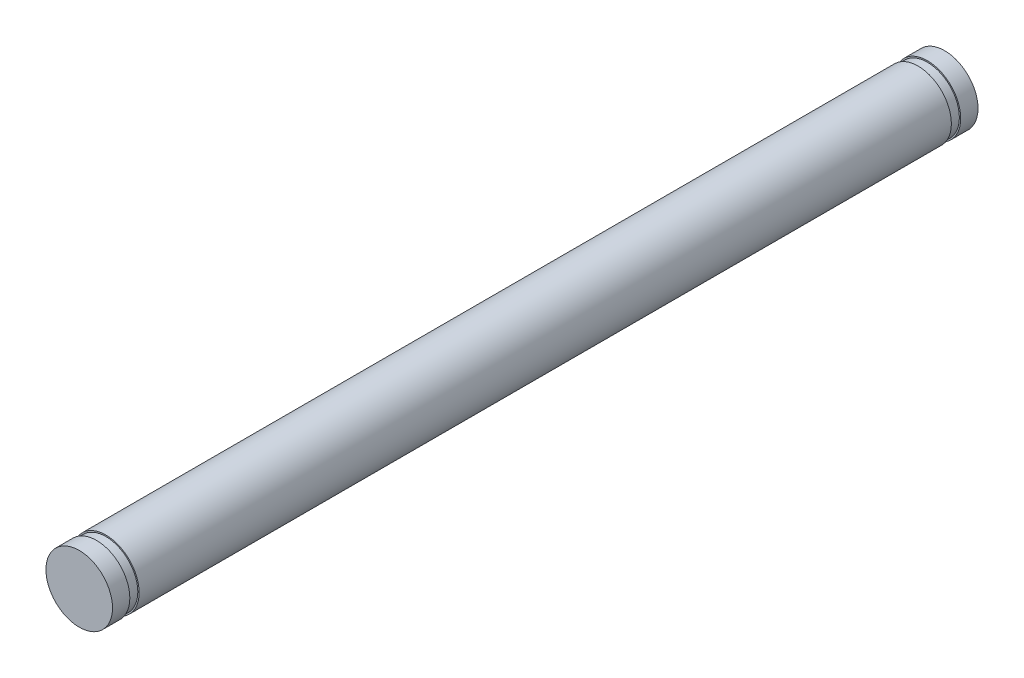
ISO-10303-21;
HEADER;
FILE_DESCRIPTION(('STEP AP214'),'2;1');
FILE_NAME('part.step','',(''),(''),'','','');
FILE_SCHEMA(('AUTOMOTIVE_DESIGN { 1 0 10303 214 1 1 1 1 }'));
ENDSEC;
DATA;
#1=APPLICATION_CONTEXT('core data for automotive mechanical design processes');
#2=APPLICATION_PROTOCOL_DEFINITION('international standard','automotive_design',2000,#1);
#3=PRODUCT_CONTEXT('',#1,'mechanical');
#4=PRODUCT('Part','Part','',(#3));
#5=PRODUCT_RELATED_PRODUCT_CATEGORY('part','',(#4));
#6=PRODUCT_DEFINITION_FORMATION('','',#4);
#7=PRODUCT_DEFINITION_CONTEXT('part definition',#1,'design');
#8=PRODUCT_DEFINITION('design','',#6,#7);
#9=PRODUCT_DEFINITION_SHAPE('','',#8);
#10=(LENGTH_UNIT() NAMED_UNIT(*) SI_UNIT(.MILLI.,.METRE.));
#11=(NAMED_UNIT(*) PLANE_ANGLE_UNIT() SI_UNIT($,.RADIAN.));
#12=(NAMED_UNIT(*) SI_UNIT($,.STERADIAN.) SOLID_ANGLE_UNIT());
#13=UNCERTAINTY_MEASURE_WITH_UNIT(LENGTH_MEASURE(1.E-05),#10,'distance_accuracy_value','');
#14=(GEOMETRIC_REPRESENTATION_CONTEXT(3) GLOBAL_UNCERTAINTY_ASSIGNED_CONTEXT((#13)) GLOBAL_UNIT_ASSIGNED_CONTEXT((#10,
#11,#12)) REPRESENTATION_CONTEXT('',''));
#15=CARTESIAN_POINT('',(0.,0.,0.));
#16=DIRECTION('',(0.,0.,1.));
#17=DIRECTION('',(1.,0.,0.));
#18=AXIS2_PLACEMENT_3D('',#15,#16,#17);
#19=CARTESIAN_POINT('',(0.,0.,32.5));
#20=DIRECTION('',(0.,0.,1.));
#21=DIRECTION('',(1.,0.,0.));
#22=AXIS2_PLACEMENT_3D('',#19,#20,#21);
#23=PLANE('',#22);
#24=CARTESIAN_POINT('',(0.,0.,32.5));
#25=DIRECTION('',(0.,0.,1.));
#26=DIRECTION('',(1.,0.,0.));
#27=AXIS2_PLACEMENT_3D('',#24,#25,#26);
#28=CIRCLE('',#27,2.5);
#29=CARTESIAN_POINT('',(2.5,0.,32.5));
#30=VERTEX_POINT('',#29);
#31=EDGE_CURVE('E10',#30,#30,#28,.T.);
#32=ORIENTED_EDGE('',*,*,#31,.T.);
#33=EDGE_LOOP('',(#32));
#34=FACE_BOUND('',#33,.T.);
#35=ADVANCED_FACE('F37',(#34),#23,.T.);
#36=CARTESIAN_POINT('',(0.,0.,32.5));
#37=DIRECTION('',(0.,0.,1.));
#38=DIRECTION('',(1.,0.,0.));
#39=AXIS2_PLACEMENT_3D('',#36,#37,#38);
#40=CYLINDRICAL_SURFACE('',#39,2.5);
#41=CARTESIAN_POINT('',(0.,0.,31.2));
#42=DIRECTION('',(0.,0.,1.));
#43=DIRECTION('',(1.,0.,0.));
#44=AXIS2_PLACEMENT_3D('',#41,#42,#43);
#45=CIRCLE('',#44,2.5);
#46=CARTESIAN_POINT('',(2.5,0.,31.2));
#47=VERTEX_POINT('',#46);
#48=EDGE_CURVE('E44',#47,#47,#45,.T.);
#49=ORIENTED_EDGE('',*,*,#48,.T.);
#50=EDGE_LOOP('',(#49));
#51=FACE_BOUND('',#50,.T.);
#52=ORIENTED_EDGE('',*,*,#31,.F.);
#53=EDGE_LOOP('',(#52));
#54=FACE_BOUND('',#53,.T.);
#55=ADVANCED_FACE('F97',(#51,#54),#40,.T.);
#56=CARTESIAN_POINT('',(0.,-2.5,31.2));
#57=DIRECTION('',(0.,0.,-1.));
#58=DIRECTION('',(-1.,0.,0.));
#59=AXIS2_PLACEMENT_3D('',#56,#57,#58);
#60=PLANE('',#59);
#61=CARTESIAN_POINT('',(0.,0.,31.2));
#62=DIRECTION('',(0.,0.,1.));
#63=DIRECTION('',(1.,0.,0.));
#64=AXIS2_PLACEMENT_3D('',#61,#62,#63);
#65=CIRCLE('',#64,2.4);
#66=CARTESIAN_POINT('',(2.4,0.,31.2));
#67=VERTEX_POINT('',#66);
#68=EDGE_CURVE('E49',#67,#67,#65,.T.);
#69=ORIENTED_EDGE('',*,*,#68,.T.);
#70=EDGE_LOOP('',(#69));
#71=FACE_BOUND('',#70,.T.);
#72=ORIENTED_EDGE('',*,*,#48,.F.);
#73=EDGE_LOOP('',(#72));
#74=FACE_BOUND('',#73,.T.);
#75=ADVANCED_FACE('F101',(#71,#74),#60,.T.);
#76=CARTESIAN_POINT('',(0.,0.,32.5));
#77=DIRECTION('',(0.,0.,1.));
#78=DIRECTION('',(1.,0.,0.));
#79=AXIS2_PLACEMENT_3D('',#76,#77,#78);
#80=CYLINDRICAL_SURFACE('',#79,2.4);
#81=CARTESIAN_POINT('',(0.,0.,30.5));
#82=DIRECTION('',(0.,0.,1.));
#83=DIRECTION('',(1.,0.,0.));
#84=AXIS2_PLACEMENT_3D('',#81,#82,#83);
#85=CIRCLE('',#84,2.4);
#86=CARTESIAN_POINT('',(2.4,0.,30.5));
#87=VERTEX_POINT('',#86);
#88=EDGE_CURVE('E54',#87,#87,#85,.T.);
#89=ORIENTED_EDGE('',*,*,#88,.T.);
#90=EDGE_LOOP('',(#89));
#91=FACE_BOUND('',#90,.T.);
#92=ORIENTED_EDGE('',*,*,#68,.F.);
#93=EDGE_LOOP('',(#92));
#94=FACE_BOUND('',#93,.T.);
#95=ADVANCED_FACE('F105',(#91,#94),#80,.T.);
#96=CARTESIAN_POINT('',(0.,-2.4,30.5));
#97=DIRECTION('',(0.,0.,1.));
#98=DIRECTION('',(1.,0.,0.));
#99=AXIS2_PLACEMENT_3D('',#96,#97,#98);
#100=PLANE('',#99);
#101=CARTESIAN_POINT('',(0.,0.,30.5));
#102=DIRECTION('',(0.,0.,1.));
#103=DIRECTION('',(1.,0.,0.));
#104=AXIS2_PLACEMENT_3D('',#101,#102,#103);
#105=CIRCLE('',#104,2.5);
#106=CARTESIAN_POINT('',(2.5,0.,30.5));
#107=VERTEX_POINT('',#106);
#108=EDGE_CURVE('E60',#107,#107,#105,.T.);
#109=ORIENTED_EDGE('',*,*,#108,.T.);
#110=EDGE_LOOP('',(#109));
#111=FACE_BOUND('',#110,.T.);
#112=ORIENTED_EDGE('',*,*,#88,.F.);
#113=EDGE_LOOP('',(#112));
#114=FACE_BOUND('',#113,.T.);
#115=ADVANCED_FACE('F112',(#111,#114),#100,.T.);
#116=CARTESIAN_POINT('',(0.,0.,32.5));
#117=DIRECTION('',(0.,0.,1.));
#118=DIRECTION('',(1.,0.,0.));
#119=AXIS2_PLACEMENT_3D('',#116,#117,#118);
#120=CYLINDRICAL_SURFACE('',#119,2.5);
#121=CARTESIAN_POINT('',(0.,0.,-30.5));
#122=DIRECTION('',(0.,0.,1.));
#123=DIRECTION('',(1.,0.,0.));
#124=AXIS2_PLACEMENT_3D('',#121,#122,#123);
#125=CIRCLE('',#124,2.49999999999999);
#126=CARTESIAN_POINT('',(2.49999999999999,0.,-30.5));
#127=VERTEX_POINT('',#126);
#128=EDGE_CURVE('E64',#127,#127,#125,.T.);
#129=ORIENTED_EDGE('',*,*,#128,.T.);
#130=EDGE_LOOP('',(#129));
#131=FACE_BOUND('',#130,.T.);
#132=ORIENTED_EDGE('',*,*,#108,.F.);
#133=EDGE_LOOP('',(#132));
#134=FACE_BOUND('',#133,.T.);
#135=ADVANCED_FACE('F116',(#131,#134),#120,.T.);
#136=CARTESIAN_POINT('',(0.,-2.39999999999999,-30.5));
#137=DIRECTION('',(0.,0.,-1.));
#138=DIRECTION('',(-1.,0.,0.));
#139=AXIS2_PLACEMENT_3D('',#136,#137,#138);
#140=PLANE('',#139);
#141=CARTESIAN_POINT('',(0.,0.,-30.5));
#142=DIRECTION('',(0.,0.,1.));
#143=DIRECTION('',(1.,0.,0.));
#144=AXIS2_PLACEMENT_3D('',#141,#142,#143);
#145=CIRCLE('',#144,2.39999999999999);
#146=CARTESIAN_POINT('',(2.39999999999999,0.,-30.5));
#147=VERTEX_POINT('',#146);
#148=EDGE_CURVE('E68',#147,#147,#145,.T.);
#149=ORIENTED_EDGE('',*,*,#148,.T.);
#150=EDGE_LOOP('',(#149));
#151=FACE_BOUND('',#150,.T.);
#152=ORIENTED_EDGE('',*,*,#128,.F.);
#153=EDGE_LOOP('',(#152));
#154=FACE_BOUND('',#153,.T.);
#155=ADVANCED_FACE('F120',(#151,#154),#140,.T.);
#156=CARTESIAN_POINT('',(0.,0.,32.5));
#157=DIRECTION('',(0.,0.,1.));
#158=DIRECTION('',(1.,0.,0.));
#159=AXIS2_PLACEMENT_3D('',#156,#157,#158);
#160=CYLINDRICAL_SURFACE('',#159,2.39999999999999);
#161=CARTESIAN_POINT('',(0.,0.,-31.2));
#162=DIRECTION('',(0.,0.,1.));
#163=DIRECTION('',(1.,0.,0.));
#164=AXIS2_PLACEMENT_3D('',#161,#162,#163);
#165=CIRCLE('',#164,2.39999999999999);
#166=CARTESIAN_POINT('',(2.39999999999999,0.,-31.2));
#167=VERTEX_POINT('',#166);
#168=EDGE_CURVE('E72',#167,#167,#165,.T.);
#169=ORIENTED_EDGE('',*,*,#168,.T.);
#170=EDGE_LOOP('',(#169));
#171=FACE_BOUND('',#170,.T.);
#172=ORIENTED_EDGE('',*,*,#148,.F.);
#173=EDGE_LOOP('',(#172));
#174=FACE_BOUND('',#173,.T.);
#175=ADVANCED_FACE('F124',(#171,#174),#160,.T.);
#176=CARTESIAN_POINT('',(0.,-2.49999999999999,-31.2));
#177=DIRECTION('',(0.,0.,1.));
#178=DIRECTION('',(1.,0.,0.));
#179=AXIS2_PLACEMENT_3D('',#176,#177,#178);
#180=PLANE('',#179);
#181=CARTESIAN_POINT('',(0.,0.,-31.2));
#182=DIRECTION('',(0.,0.,1.));
#183=DIRECTION('',(1.,0.,0.));
#184=AXIS2_PLACEMENT_3D('',#181,#182,#183);
#185=CIRCLE('',#184,2.49999999999999);
#186=CARTESIAN_POINT('',(2.49999999999999,0.,-31.2));
#187=VERTEX_POINT('',#186);
#188=EDGE_CURVE('E76',#187,#187,#185,.T.);
#189=ORIENTED_EDGE('',*,*,#188,.T.);
#190=EDGE_LOOP('',(#189));
#191=FACE_BOUND('',#190,.T.);
#192=ORIENTED_EDGE('',*,*,#168,.F.);
#193=EDGE_LOOP('',(#192));
#194=FACE_BOUND('',#193,.T.);
#195=ADVANCED_FACE('F94',(#191,#194),#180,.T.);
#196=CARTESIAN_POINT('',(0.,0.,32.5));
#197=DIRECTION('',(0.,0.,1.));
#198=DIRECTION('',(1.,0.,0.));
#199=AXIS2_PLACEMENT_3D('',#196,#197,#198);
#200=CYLINDRICAL_SURFACE('',#199,2.5);
#201=CARTESIAN_POINT('',(0.,0.,-32.5));
#202=DIRECTION('',(0.,0.,1.));
#203=DIRECTION('',(1.,0.,0.));
#204=AXIS2_PLACEMENT_3D('',#201,#202,#203);
#205=CIRCLE('',#204,2.5);
#206=CARTESIAN_POINT('',(2.5,0.,-32.5));
#207=VERTEX_POINT('',#206);
#208=EDGE_CURVE('E80',#207,#207,#205,.T.);
#209=ORIENTED_EDGE('',*,*,#208,.T.);
#210=EDGE_LOOP('',(#209));
#211=FACE_BOUND('',#210,.T.);
#212=ORIENTED_EDGE('',*,*,#188,.F.);
#213=EDGE_LOOP('',(#212));
#214=FACE_BOUND('',#213,.T.);
#215=ADVANCED_FACE('F85',(#211,#214),#200,.T.);
#216=CARTESIAN_POINT('',(0.,0.,-32.5));
#217=DIRECTION('',(0.,0.,-1.));
#218=DIRECTION('',(-1.,0.,0.));
#219=AXIS2_PLACEMENT_3D('',#216,#217,#218);
#220=PLANE('',#219);
#221=ORIENTED_EDGE('',*,*,#208,.F.);
#222=EDGE_LOOP('',(#221));
#223=FACE_BOUND('',#222,.T.);
#224=ADVANCED_FACE('F88',(#223),#220,.T.);
#225=CLOSED_SHELL('',(#35,#55,#75,#95,#115,#135,#155,#175,#195,#215,#224));
#226=MANIFOLD_SOLID_BREP('B2',#225);
#227=ADVANCED_BREP_SHAPE_REPRESENTATION('',(#18,#226),#14);
#228=SHAPE_DEFINITION_REPRESENTATION(#9,#227);
ENDSEC;
END-ISO-10303-21;
